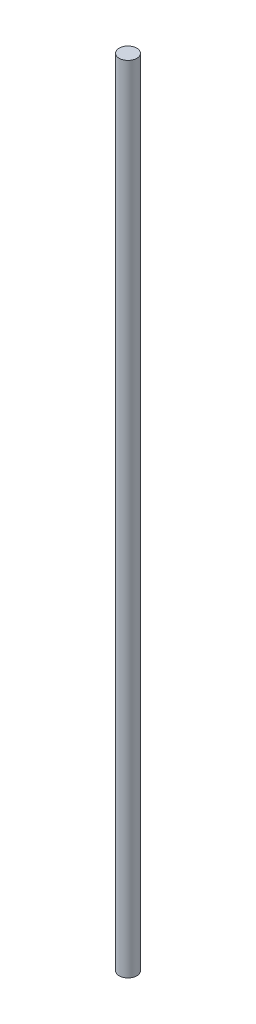
ISO-10303-21;
HEADER;
FILE_DESCRIPTION(('STEP AP214'),'2;1');
FILE_NAME('part.step','',(''),(''),'','','');
FILE_SCHEMA(('AUTOMOTIVE_DESIGN { 1 0 10303 214 1 1 1 1 }'));
ENDSEC;
DATA;
#1=APPLICATION_CONTEXT('core data for automotive mechanical design processes');
#2=APPLICATION_PROTOCOL_DEFINITION('international standard','automotive_design',2000,#1);
#3=PRODUCT_CONTEXT('',#1,'mechanical');
#4=PRODUCT('Part','Part','',(#3));
#5=PRODUCT_RELATED_PRODUCT_CATEGORY('part','',(#4));
#6=PRODUCT_DEFINITION_FORMATION('','',#4);
#7=PRODUCT_DEFINITION_CONTEXT('part definition',#1,'design');
#8=PRODUCT_DEFINITION('design','',#6,#7);
#9=PRODUCT_DEFINITION_SHAPE('','',#8);
#10=(LENGTH_UNIT() NAMED_UNIT(*) SI_UNIT(.MILLI.,.METRE.));
#11=(NAMED_UNIT(*) PLANE_ANGLE_UNIT() SI_UNIT($,.RADIAN.));
#12=(NAMED_UNIT(*) SI_UNIT($,.STERADIAN.) SOLID_ANGLE_UNIT());
#13=UNCERTAINTY_MEASURE_WITH_UNIT(LENGTH_MEASURE(1.E-05),#10,'distance_accuracy_value','');
#14=(GEOMETRIC_REPRESENTATION_CONTEXT(3) GLOBAL_UNCERTAINTY_ASSIGNED_CONTEXT((#13)) GLOBAL_UNIT_ASSIGNED_CONTEXT((#10,
#11,#12)) REPRESENTATION_CONTEXT('',''));
#15=CARTESIAN_POINT('',(0.,0.,0.));
#16=DIRECTION('',(0.,0.,1.));
#17=DIRECTION('',(1.,0.,0.));
#18=AXIS2_PLACEMENT_3D('',#15,#16,#17);
#19=CARTESIAN_POINT('',(0.,450.,0.));
#20=DIRECTION('',(0.,-1.,0.));
#21=DIRECTION('',(0.,0.,-1.));
#22=AXIS2_PLACEMENT_3D('',#19,#20,#21);
#23=CYLINDRICAL_SURFACE('',#22,5.);
#24=CARTESIAN_POINT('',(0.,450.,0.));
#25=DIRECTION('',(0.,1.,0.));
#26=DIRECTION('',(0.,0.,1.));
#27=AXIS2_PLACEMENT_3D('',#24,#25,#26);
#28=CIRCLE('',#27,5.);
#29=CARTESIAN_POINT('',(0.,450.,5.));
#30=VERTEX_POINT('',#29);
#31=EDGE_CURVE('E10',#30,#30,#28,.T.);
#32=ORIENTED_EDGE('',*,*,#31,.F.);
#33=EDGE_LOOP('',(#32));
#34=FACE_BOUND('',#33,.T.);
#35=CARTESIAN_POINT('',(0.,0.,0.));
#36=DIRECTION('',(0.,1.,0.));
#37=DIRECTION('',(0.,0.,1.));
#38=AXIS2_PLACEMENT_3D('',#35,#36,#37);
#39=CIRCLE('',#38,5.);
#40=CARTESIAN_POINT('',(0.,0.,5.));
#41=VERTEX_POINT('',#40);
#42=EDGE_CURVE('E40',#41,#41,#39,.T.);
#43=ORIENTED_EDGE('',*,*,#42,.T.);
#44=EDGE_LOOP('',(#43));
#45=FACE_BOUND('',#44,.T.);
#46=ADVANCED_FACE('F37',(#34,#45),#23,.T.);
#47=CARTESIAN_POINT('',(0.,450.,0.));
#48=DIRECTION('',(0.,1.,0.));
#49=DIRECTION('',(0.,0.,1.));
#50=AXIS2_PLACEMENT_3D('',#47,#48,#49);
#51=PLANE('',#50);
#52=ORIENTED_EDGE('',*,*,#31,.T.);
#53=EDGE_LOOP('',(#52));
#54=FACE_BOUND('',#53,.T.);
#55=ADVANCED_FACE('F54',(#54),#51,.T.);
#56=CARTESIAN_POINT('',(0.,0.,0.));
#57=DIRECTION('',(0.,1.,0.));
#58=DIRECTION('',(0.,0.,1.));
#59=AXIS2_PLACEMENT_3D('',#56,#57,#58);
#60=PLANE('',#59);
#61=ORIENTED_EDGE('',*,*,#42,.F.);
#62=EDGE_LOOP('',(#61));
#63=FACE_BOUND('',#62,.T.);
#64=ADVANCED_FACE('F52',(#63),#60,.F.);
#65=CLOSED_SHELL('',(#46,#55,#64));
#66=MANIFOLD_SOLID_BREP('B2',#65);
#67=ADVANCED_BREP_SHAPE_REPRESENTATION('',(#18,#66),#14);
#68=SHAPE_DEFINITION_REPRESENTATION(#9,#67);
ENDSEC;
END-ISO-10303-21;
